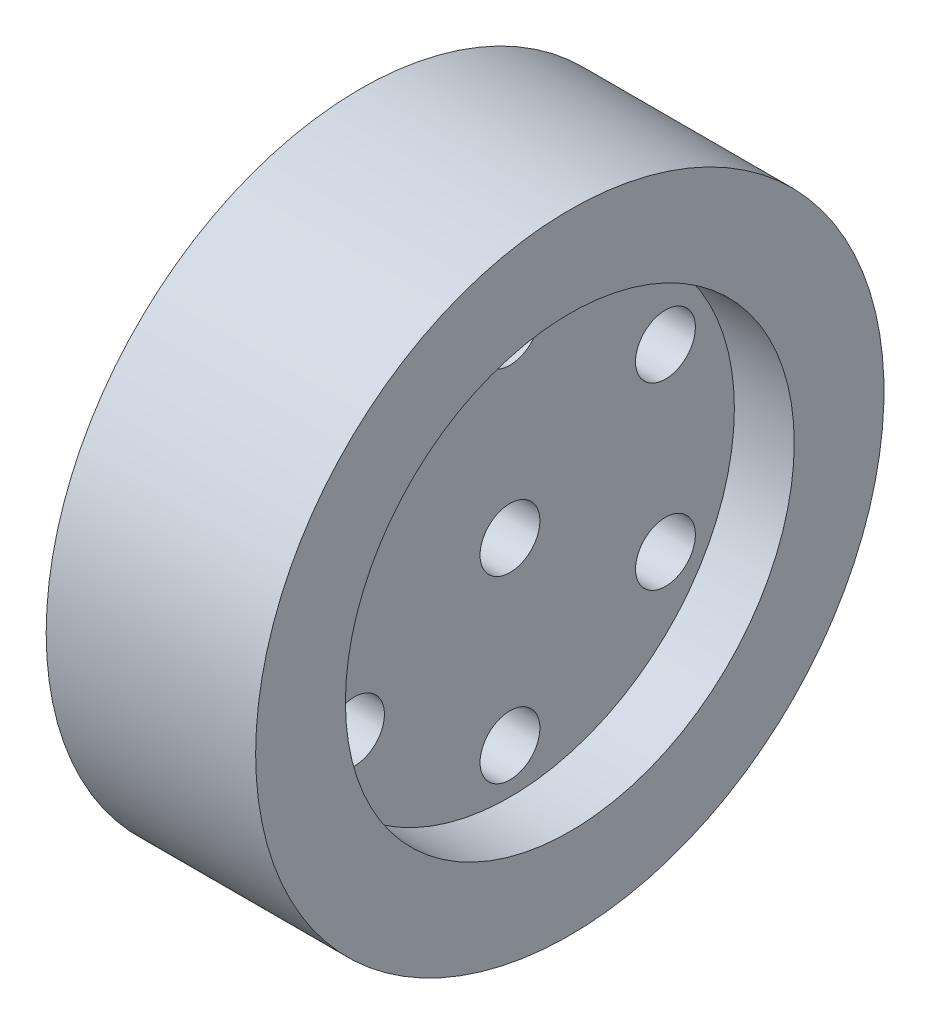
ISO-10303-21;
HEADER;
FILE_DESCRIPTION(('STEP AP214'),'2;1');
FILE_NAME('part.step','',(''),(''),'','','');
FILE_SCHEMA(('AUTOMOTIVE_DESIGN { 1 0 10303 214 1 1 1 1 }'));
ENDSEC;
DATA;
#1=APPLICATION_CONTEXT('core data for automotive mechanical design processes');
#2=APPLICATION_PROTOCOL_DEFINITION('international standard','automotive_design',2000,#1);
#3=PRODUCT_CONTEXT('',#1,'mechanical');
#4=PRODUCT('Part','Part','',(#3));
#5=PRODUCT_RELATED_PRODUCT_CATEGORY('part','',(#4));
#6=PRODUCT_DEFINITION_FORMATION('','',#4);
#7=PRODUCT_DEFINITION_CONTEXT('part definition',#1,'design');
#8=PRODUCT_DEFINITION('design','',#6,#7);
#9=PRODUCT_DEFINITION_SHAPE('','',#8);
#10=(LENGTH_UNIT() NAMED_UNIT(*) SI_UNIT(.MILLI.,.METRE.));
#11=(NAMED_UNIT(*) PLANE_ANGLE_UNIT() SI_UNIT($,.RADIAN.));
#12=(NAMED_UNIT(*) SI_UNIT($,.STERADIAN.) SOLID_ANGLE_UNIT());
#13=UNCERTAINTY_MEASURE_WITH_UNIT(LENGTH_MEASURE(1.E-05),#10,'distance_accuracy_value','');
#14=(GEOMETRIC_REPRESENTATION_CONTEXT(3) GLOBAL_UNCERTAINTY_ASSIGNED_CONTEXT((#13)) GLOBAL_UNIT_ASSIGNED_CONTEXT((#10,
#11,#12)) REPRESENTATION_CONTEXT('',''));
#15=CARTESIAN_POINT('',(0.,0.,0.));
#16=DIRECTION('',(0.,0.,1.));
#17=DIRECTION('',(1.,0.,0.));
#18=AXIS2_PLACEMENT_3D('',#15,#16,#17);
#19=CARTESIAN_POINT('',(4.,19.,0.));
#20=DIRECTION('',(1.,0.,0.));
#21=DIRECTION('',(0.,0.,-1.));
#22=AXIS2_PLACEMENT_3D('',#19,#20,#21);
#23=PLANE('',#22);
#24=CARTESIAN_POINT('',(4.,12.,0.));
#25=DIRECTION('',(-1.,0.,0.));
#26=DIRECTION('',(0.,0.,1.));
#27=AXIS2_PLACEMENT_3D('',#24,#25,#26);
#28=CIRCLE('',#27,2.);
#29=CARTESIAN_POINT('',(4.,12.,2.));
#30=VERTEX_POINT('',#29);
#31=EDGE_CURVE('E105',#30,#30,#28,.T.);
#32=ORIENTED_EDGE('',*,*,#31,.F.);
#33=EDGE_LOOP('',(#32));
#34=FACE_BOUND('',#33,.T.);
#35=CARTESIAN_POINT('',(4.,5.99999999999999,-10.3923048454133));
#36=DIRECTION('',(-1.,0.,0.));
#37=DIRECTION('',(0.,0.,1.));
#38=AXIS2_PLACEMENT_3D('',#35,#36,#37);
#39=CIRCLE('',#38,2.);
#40=CARTESIAN_POINT('',(4.,5.99999999999999,-8.39230484541327));
#41=VERTEX_POINT('',#40);
#42=EDGE_CURVE('E111',#41,#41,#39,.T.);
#43=ORIENTED_EDGE('',*,*,#42,.F.);
#44=EDGE_LOOP('',(#43));
#45=FACE_BOUND('',#44,.T.);
#46=CARTESIAN_POINT('',(4.,-12.,0.));
#47=DIRECTION('',(-1.,0.,0.));
#48=DIRECTION('',(0.,0.,1.));
#49=AXIS2_PLACEMENT_3D('',#46,#47,#48);
#50=CIRCLE('',#49,2.);
#51=CARTESIAN_POINT('',(4.,-12.,2.));
#52=VERTEX_POINT('',#51);
#53=EDGE_CURVE('E110',#52,#52,#50,.T.);
#54=ORIENTED_EDGE('',*,*,#53,.F.);
#55=EDGE_LOOP('',(#54));
#56=FACE_BOUND('',#55,.T.);
#57=CARTESIAN_POINT('',(4.,-6.,10.3923048454133));
#58=DIRECTION('',(-1.,0.,0.));
#59=DIRECTION('',(0.,0.,1.));
#60=AXIS2_PLACEMENT_3D('',#57,#58,#59);
#61=CIRCLE('',#60,2.);
#62=CARTESIAN_POINT('',(4.,-6.,12.3923048454133));
#63=VERTEX_POINT('',#62);
#64=EDGE_CURVE('E115',#63,#63,#61,.T.);
#65=ORIENTED_EDGE('',*,*,#64,.F.);
#66=EDGE_LOOP('',(#65));
#67=FACE_BOUND('',#66,.T.);
#68=CARTESIAN_POINT('',(4.,6.,10.3923048454133));
#69=DIRECTION('',(-1.,0.,0.));
#70=DIRECTION('',(0.,0.,1.));
#71=AXIS2_PLACEMENT_3D('',#68,#69,#70);
#72=CIRCLE('',#71,2.);
#73=CARTESIAN_POINT('',(4.,6.,12.3923048454133));
#74=VERTEX_POINT('',#73);
#75=EDGE_CURVE('E119',#74,#74,#72,.T.);
#76=ORIENTED_EDGE('',*,*,#75,.F.);
#77=EDGE_LOOP('',(#76));
#78=FACE_BOUND('',#77,.T.);
#79=CARTESIAN_POINT('',(4.,0.,0.));
#80=DIRECTION('',(-1.,0.,0.));
#81=DIRECTION('',(0.,0.,1.));
#82=AXIS2_PLACEMENT_3D('',#79,#80,#81);
#83=CIRCLE('',#82,5.);
#84=CARTESIAN_POINT('',(4.,0.,5.));
#85=VERTEX_POINT('',#84);
#86=EDGE_CURVE('E77',#85,#85,#83,.T.);
#87=ORIENTED_EDGE('',*,*,#86,.F.);
#88=EDGE_LOOP('',(#87));
#89=FACE_BOUND('',#88,.T.);
#90=CARTESIAN_POINT('',(4.,0.,0.));
#91=DIRECTION('',(-1.,0.,0.));
#92=DIRECTION('',(0.,0.,1.));
#93=AXIS2_PLACEMENT_3D('',#90,#91,#92);
#94=CIRCLE('',#93,19.);
#95=CARTESIAN_POINT('',(4.,0.,19.));
#96=VERTEX_POINT('',#95);
#97=EDGE_CURVE('E73',#96,#96,#94,.T.);
#98=ORIENTED_EDGE('',*,*,#97,.T.);
#99=EDGE_LOOP('',(#98));
#100=FACE_BOUND('',#99,.T.);
#101=CARTESIAN_POINT('',(4.,-6.00000000000001,-10.3923048454133));
#102=DIRECTION('',(-1.,0.,0.));
#103=DIRECTION('',(0.,0.,1.));
#104=AXIS2_PLACEMENT_3D('',#101,#102,#103);
#105=CIRCLE('',#104,2.);
#106=CARTESIAN_POINT('',(4.,-6.00000000000001,-8.39230484541326));
#107=VERTEX_POINT('',#106);
#108=EDGE_CURVE('E106',#107,#107,#105,.T.);
#109=ORIENTED_EDGE('',*,*,#108,.F.);
#110=EDGE_LOOP('',(#109));
#111=FACE_BOUND('',#110,.T.);
#112=ADVANCED_FACE('F37',(#34,#45,#56,#67,#78,#89,#100,#111),#23,.F.);
#113=CARTESIAN_POINT('',(0.,5.,0.));
#114=DIRECTION('',(1.,0.,0.));
#115=DIRECTION('',(0.,0.,-1.));
#116=AXIS2_PLACEMENT_3D('',#113,#114,#115);
#117=PLANE('',#116);
#118=CARTESIAN_POINT('',(0.,0.,0.));
#119=DIRECTION('',(-1.,0.,0.));
#120=DIRECTION('',(0.,0.,1.));
#121=AXIS2_PLACEMENT_3D('',#118,#119,#120);
#122=CIRCLE('',#121,2.);
#123=CARTESIAN_POINT('',(0.,0.,2.));
#124=VERTEX_POINT('',#123);
#125=EDGE_CURVE('E10',#124,#124,#122,.T.);
#126=ORIENTED_EDGE('',*,*,#125,.F.);
#127=EDGE_LOOP('',(#126));
#128=FACE_BOUND('',#127,.T.);
#129=CARTESIAN_POINT('',(0.,0.,0.));
#130=DIRECTION('',(-1.,0.,0.));
#131=DIRECTION('',(0.,0.,1.));
#132=AXIS2_PLACEMENT_3D('',#129,#130,#131);
#133=CIRCLE('',#132,5.);
#134=CARTESIAN_POINT('',(0.,0.,5.));
#135=VERTEX_POINT('',#134);
#136=EDGE_CURVE('E81',#135,#135,#133,.T.);
#137=ORIENTED_EDGE('',*,*,#136,.T.);
#138=EDGE_LOOP('',(#137));
#139=FACE_BOUND('',#138,.T.);
#140=ADVANCED_FACE('F39',(#128,#139),#117,.F.);
#141=CARTESIAN_POINT('',(0.,0.,0.));
#142=DIRECTION('',(-1.,0.,0.));
#143=DIRECTION('',(0.,0.,1.));
#144=AXIS2_PLACEMENT_3D('',#141,#142,#143);
#145=CYLINDRICAL_SURFACE('',#144,2.);
#146=CARTESIAN_POINT('',(10.,0.,0.));
#147=DIRECTION('',(-1.,0.,0.));
#148=DIRECTION('',(0.,0.,1.));
#149=AXIS2_PLACEMENT_3D('',#146,#147,#148);
#150=CIRCLE('',#149,2.);
#151=CARTESIAN_POINT('',(10.,0.,2.));
#152=VERTEX_POINT('',#151);
#153=EDGE_CURVE('E46',#152,#152,#150,.T.);
#154=ORIENTED_EDGE('',*,*,#153,.F.);
#155=EDGE_LOOP('',(#154));
#156=FACE_BOUND('',#155,.T.);
#157=ORIENTED_EDGE('',*,*,#125,.T.);
#158=EDGE_LOOP('',(#157));
#159=FACE_BOUND('',#158,.T.);
#160=ADVANCED_FACE('F162',(#156,#159),#145,.F.);
#161=CARTESIAN_POINT('',(10.,2.,0.));
#162=DIRECTION('',(-1.,0.,0.));
#163=DIRECTION('',(0.,0.,1.));
#164=AXIS2_PLACEMENT_3D('',#161,#162,#163);
#165=PLANE('',#164);
#166=CARTESIAN_POINT('',(10.,12.,0.));
#167=DIRECTION('',(-1.,0.,0.));
#168=DIRECTION('',(0.,0.,1.));
#169=AXIS2_PLACEMENT_3D('',#166,#167,#168);
#170=CIRCLE('',#169,2.);
#171=CARTESIAN_POINT('',(10.,12.,2.));
#172=VERTEX_POINT('',#171);
#173=EDGE_CURVE('E85',#172,#172,#170,.T.);
#174=ORIENTED_EDGE('',*,*,#173,.T.);
#175=EDGE_LOOP('',(#174));
#176=FACE_BOUND('',#175,.T.);
#177=CARTESIAN_POINT('',(10.,5.99999999999999,-10.3923048454133));
#178=DIRECTION('',(-1.,0.,0.));
#179=DIRECTION('',(0.,0.,1.));
#180=AXIS2_PLACEMENT_3D('',#177,#178,#179);
#181=CIRCLE('',#180,2.);
#182=CARTESIAN_POINT('',(10.,5.99999999999999,-8.39230484541327));
#183=VERTEX_POINT('',#182);
#184=EDGE_CURVE('E89',#183,#183,#181,.T.);
#185=ORIENTED_EDGE('',*,*,#184,.T.);
#186=EDGE_LOOP('',(#185));
#187=FACE_BOUND('',#186,.T.);
#188=CARTESIAN_POINT('',(10.,-6.00000000000001,-10.3923048454133));
#189=DIRECTION('',(-1.,0.,0.));
#190=DIRECTION('',(0.,0.,1.));
#191=AXIS2_PLACEMENT_3D('',#188,#189,#190);
#192=CIRCLE('',#191,2.);
#193=CARTESIAN_POINT('',(10.,-6.00000000000001,-8.39230484541326));
#194=VERTEX_POINT('',#193);
#195=EDGE_CURVE('E41',#194,#194,#192,.T.);
#196=ORIENTED_EDGE('',*,*,#195,.T.);
#197=EDGE_LOOP('',(#196));
#198=FACE_BOUND('',#197,.T.);
#199=CARTESIAN_POINT('',(10.,-12.,0.));
#200=DIRECTION('',(-1.,0.,0.));
#201=DIRECTION('',(0.,0.,1.));
#202=AXIS2_PLACEMENT_3D('',#199,#200,#201);
#203=CIRCLE('',#202,2.);
#204=CARTESIAN_POINT('',(10.,-12.,2.));
#205=VERTEX_POINT('',#204);
#206=EDGE_CURVE('E93',#205,#205,#203,.T.);
#207=ORIENTED_EDGE('',*,*,#206,.T.);
#208=EDGE_LOOP('',(#207));
#209=FACE_BOUND('',#208,.T.);
#210=CARTESIAN_POINT('',(10.,-6.,10.3923048454133));
#211=DIRECTION('',(-1.,0.,0.));
#212=DIRECTION('',(0.,0.,1.));
#213=AXIS2_PLACEMENT_3D('',#210,#211,#212);
#214=CIRCLE('',#213,2.);
#215=CARTESIAN_POINT('',(10.,-6.,12.3923048454133));
#216=VERTEX_POINT('',#215);
#217=EDGE_CURVE('E97',#216,#216,#214,.T.);
#218=ORIENTED_EDGE('',*,*,#217,.T.);
#219=EDGE_LOOP('',(#218));
#220=FACE_BOUND('',#219,.T.);
#221=CARTESIAN_POINT('',(10.,6.,10.3923048454133));
#222=DIRECTION('',(-1.,0.,0.));
#223=DIRECTION('',(0.,0.,1.));
#224=AXIS2_PLACEMENT_3D('',#221,#222,#223);
#225=CIRCLE('',#224,2.);
#226=CARTESIAN_POINT('',(10.,6.,12.3923048454133));
#227=VERTEX_POINT('',#226);
#228=EDGE_CURVE('E101',#227,#227,#225,.T.);
#229=ORIENTED_EDGE('',*,*,#228,.T.);
#230=EDGE_LOOP('',(#229));
#231=FACE_BOUND('',#230,.T.);
#232=CARTESIAN_POINT('',(10.,0.,0.));
#233=DIRECTION('',(-1.,0.,0.));
#234=DIRECTION('',(0.,0.,1.));
#235=AXIS2_PLACEMENT_3D('',#232,#233,#234);
#236=CIRCLE('',#235,15.);
#237=CARTESIAN_POINT('',(10.,0.,15.));
#238=VERTEX_POINT('',#237);
#239=EDGE_CURVE('E51',#238,#238,#236,.T.);
#240=ORIENTED_EDGE('',*,*,#239,.F.);
#241=EDGE_LOOP('',(#240));
#242=FACE_BOUND('',#241,.T.);
#243=ORIENTED_EDGE('',*,*,#153,.T.);
#244=EDGE_LOOP('',(#243));
#245=FACE_BOUND('',#244,.T.);
#246=ADVANCED_FACE('F158',(#176,#187,#198,#209,#220,#231,#242,#245),#165,.F.);
#247=CARTESIAN_POINT('',(0.,0.,0.));
#248=DIRECTION('',(-1.,0.,0.));
#249=DIRECTION('',(0.,0.,1.));
#250=AXIS2_PLACEMENT_3D('',#247,#248,#249);
#251=CYLINDRICAL_SURFACE('',#250,15.);
#252=CARTESIAN_POINT('',(14.,0.,0.));
#253=DIRECTION('',(-1.,0.,0.));
#254=DIRECTION('',(0.,0.,1.));
#255=AXIS2_PLACEMENT_3D('',#252,#253,#254);
#256=CIRCLE('',#255,15.);
#257=CARTESIAN_POINT('',(14.,0.,15.));
#258=VERTEX_POINT('',#257);
#259=EDGE_CURVE('E57',#258,#258,#256,.T.);
#260=ORIENTED_EDGE('',*,*,#259,.F.);
#261=EDGE_LOOP('',(#260));
#262=FACE_BOUND('',#261,.T.);
#263=ORIENTED_EDGE('',*,*,#239,.T.);
#264=EDGE_LOOP('',(#263));
#265=FACE_BOUND('',#264,.T.);
#266=ADVANCED_FACE('F161',(#262,#265),#251,.F.);
#267=CARTESIAN_POINT('',(14.,15.,0.));
#268=DIRECTION('',(-1.,0.,0.));
#269=DIRECTION('',(0.,0.,1.));
#270=AXIS2_PLACEMENT_3D('',#267,#268,#269);
#271=PLANE('',#270);
#272=CARTESIAN_POINT('',(14.,0.,0.));
#273=DIRECTION('',(-1.,0.,0.));
#274=DIRECTION('',(0.,0.,1.));
#275=AXIS2_PLACEMENT_3D('',#272,#273,#274);
#276=CIRCLE('',#275,21.);
#277=CARTESIAN_POINT('',(14.,0.,21.));
#278=VERTEX_POINT('',#277);
#279=EDGE_CURVE('E61',#278,#278,#276,.T.);
#280=ORIENTED_EDGE('',*,*,#279,.F.);
#281=EDGE_LOOP('',(#280));
#282=FACE_BOUND('',#281,.T.);
#283=ORIENTED_EDGE('',*,*,#259,.T.);
#284=EDGE_LOOP('',(#283));
#285=FACE_BOUND('',#284,.T.);
#286=ADVANCED_FACE('F183',(#282,#285),#271,.F.);
#287=CARTESIAN_POINT('',(0.,0.,0.));
#288=DIRECTION('',(-1.,0.,0.));
#289=DIRECTION('',(0.,0.,1.));
#290=AXIS2_PLACEMENT_3D('',#287,#288,#289);
#291=CYLINDRICAL_SURFACE('',#290,21.);
#292=CARTESIAN_POINT('',(0.,0.,0.));
#293=DIRECTION('',(-1.,0.,0.));
#294=DIRECTION('',(0.,0.,1.));
#295=AXIS2_PLACEMENT_3D('',#292,#293,#294);
#296=CIRCLE('',#295,21.);
#297=CARTESIAN_POINT('',(0.,0.,21.));
#298=VERTEX_POINT('',#297);
#299=EDGE_CURVE('E65',#298,#298,#296,.T.);
#300=ORIENTED_EDGE('',*,*,#299,.F.);
#301=EDGE_LOOP('',(#300));
#302=FACE_BOUND('',#301,.T.);
#303=ORIENTED_EDGE('',*,*,#279,.T.);
#304=EDGE_LOOP('',(#303));
#305=FACE_BOUND('',#304,.T.);
#306=ADVANCED_FACE('F187',(#302,#305),#291,.T.);
#307=CARTESIAN_POINT('',(0.,21.,0.));
#308=DIRECTION('',(1.,0.,0.));
#309=DIRECTION('',(0.,0.,-1.));
#310=AXIS2_PLACEMENT_3D('',#307,#308,#309);
#311=PLANE('',#310);
#312=CARTESIAN_POINT('',(0.,0.,0.));
#313=DIRECTION('',(-1.,0.,0.));
#314=DIRECTION('',(0.,0.,1.));
#315=AXIS2_PLACEMENT_3D('',#312,#313,#314);
#316=CIRCLE('',#315,19.);
#317=CARTESIAN_POINT('',(0.,0.,19.));
#318=VERTEX_POINT('',#317);
#319=EDGE_CURVE('E69',#318,#318,#316,.T.);
#320=ORIENTED_EDGE('',*,*,#319,.F.);
#321=EDGE_LOOP('',(#320));
#322=FACE_BOUND('',#321,.T.);
#323=ORIENTED_EDGE('',*,*,#299,.T.);
#324=EDGE_LOOP('',(#323));
#325=FACE_BOUND('',#324,.T.);
#326=ADVANCED_FACE('F191',(#322,#325),#311,.F.);
#327=CARTESIAN_POINT('',(0.,0.,0.));
#328=DIRECTION('',(-1.,0.,0.));
#329=DIRECTION('',(0.,0.,1.));
#330=AXIS2_PLACEMENT_3D('',#327,#328,#329);
#331=CYLINDRICAL_SURFACE('',#330,19.);
#332=ORIENTED_EDGE('',*,*,#97,.F.);
#333=EDGE_LOOP('',(#332));
#334=FACE_BOUND('',#333,.T.);
#335=ORIENTED_EDGE('',*,*,#319,.T.);
#336=EDGE_LOOP('',(#335));
#337=FACE_BOUND('',#336,.T.);
#338=ADVANCED_FACE('F195',(#334,#337),#331,.F.);
#339=CARTESIAN_POINT('',(0.,0.,0.));
#340=DIRECTION('',(-1.,0.,0.));
#341=DIRECTION('',(0.,0.,1.));
#342=AXIS2_PLACEMENT_3D('',#339,#340,#341);
#343=CYLINDRICAL_SURFACE('',#342,5.);
#344=ORIENTED_EDGE('',*,*,#136,.F.);
#345=EDGE_LOOP('',(#344));
#346=FACE_BOUND('',#345,.T.);
#347=ORIENTED_EDGE('',*,*,#86,.T.);
#348=EDGE_LOOP('',(#347));
#349=FACE_BOUND('',#348,.T.);
#350=ADVANCED_FACE('F198',(#346,#349),#343,.T.);
#351=CARTESIAN_POINT('',(54.,6.,10.3923048454133));
#352=DIRECTION('',(-1.,0.,0.));
#353=DIRECTION('',(0.,0.,1.));
#354=AXIS2_PLACEMENT_3D('',#351,#352,#353);
#355=CYLINDRICAL_SURFACE('',#354,2.);
#356=ORIENTED_EDGE('',*,*,#75,.T.);
#357=EDGE_LOOP('',(#356));
#358=FACE_BOUND('',#357,.T.);
#359=ORIENTED_EDGE('',*,*,#228,.F.);
#360=EDGE_LOOP('',(#359));
#361=FACE_BOUND('',#360,.T.);
#362=ADVANCED_FACE('F202',(#358,#361),#355,.F.);
#363=CARTESIAN_POINT('',(54.,-6.,10.3923048454133));
#364=DIRECTION('',(-1.,0.,0.));
#365=DIRECTION('',(0.,0.,1.));
#366=AXIS2_PLACEMENT_3D('',#363,#364,#365);
#367=CYLINDRICAL_SURFACE('',#366,2.);
#368=ORIENTED_EDGE('',*,*,#64,.T.);
#369=EDGE_LOOP('',(#368));
#370=FACE_BOUND('',#369,.T.);
#371=ORIENTED_EDGE('',*,*,#217,.F.);
#372=EDGE_LOOP('',(#371));
#373=FACE_BOUND('',#372,.T.);
#374=ADVANCED_FACE('F209',(#370,#373),#367,.F.);
#375=CARTESIAN_POINT('',(54.,-12.,0.));
#376=DIRECTION('',(-1.,0.,0.));
#377=DIRECTION('',(0.,0.,1.));
#378=AXIS2_PLACEMENT_3D('',#375,#376,#377);
#379=CYLINDRICAL_SURFACE('',#378,2.);
#380=ORIENTED_EDGE('',*,*,#53,.T.);
#381=EDGE_LOOP('',(#380));
#382=FACE_BOUND('',#381,.T.);
#383=ORIENTED_EDGE('',*,*,#206,.F.);
#384=EDGE_LOOP('',(#383));
#385=FACE_BOUND('',#384,.T.);
#386=ADVANCED_FACE('F205',(#382,#385),#379,.F.);
#387=CARTESIAN_POINT('',(54.,5.99999999999999,-10.3923048454133));
#388=DIRECTION('',(-1.,0.,0.));
#389=DIRECTION('',(0.,0.,1.));
#390=AXIS2_PLACEMENT_3D('',#387,#388,#389);
#391=CYLINDRICAL_SURFACE('',#390,2.);
#392=ORIENTED_EDGE('',*,*,#42,.T.);
#393=EDGE_LOOP('',(#392));
#394=FACE_BOUND('',#393,.T.);
#395=ORIENTED_EDGE('',*,*,#184,.F.);
#396=EDGE_LOOP('',(#395));
#397=FACE_BOUND('',#396,.T.);
#398=ADVANCED_FACE('F208',(#394,#397),#391,.F.);
#399=CARTESIAN_POINT('',(54.,12.,0.));
#400=DIRECTION('',(-1.,0.,0.));
#401=DIRECTION('',(0.,0.,1.));
#402=AXIS2_PLACEMENT_3D('',#399,#400,#401);
#403=CYLINDRICAL_SURFACE('',#402,2.);
#404=ORIENTED_EDGE('',*,*,#31,.T.);
#405=EDGE_LOOP('',(#404));
#406=FACE_BOUND('',#405,.T.);
#407=ORIENTED_EDGE('',*,*,#173,.F.);
#408=EDGE_LOOP('',(#407));
#409=FACE_BOUND('',#408,.T.);
#410=ADVANCED_FACE('F130',(#406,#409),#403,.F.);
#411=CARTESIAN_POINT('',(54.,-6.00000000000001,-10.3923048454133));
#412=DIRECTION('',(-1.,0.,0.));
#413=DIRECTION('',(0.,0.,1.));
#414=AXIS2_PLACEMENT_3D('',#411,#412,#413);
#415=CYLINDRICAL_SURFACE('',#414,2.);
#416=ORIENTED_EDGE('',*,*,#108,.T.);
#417=EDGE_LOOP('',(#416));
#418=FACE_BOUND('',#417,.T.);
#419=ORIENTED_EDGE('',*,*,#195,.F.);
#420=EDGE_LOOP('',(#419));
#421=FACE_BOUND('',#420,.T.);
#422=ADVANCED_FACE('F150',(#418,#421),#415,.F.);
#423=CLOSED_SHELL('',(#112,#140,#160,#246,#266,#286,#306,#326,#338,#350,#362,#374,#386,#398,
#410,#422));
#424=MANIFOLD_SOLID_BREP('B2',#423);
#425=ADVANCED_BREP_SHAPE_REPRESENTATION('',(#18,#424),#14);
#426=SHAPE_DEFINITION_REPRESENTATION(#9,#425);
ENDSEC;
END-ISO-10303-21;
